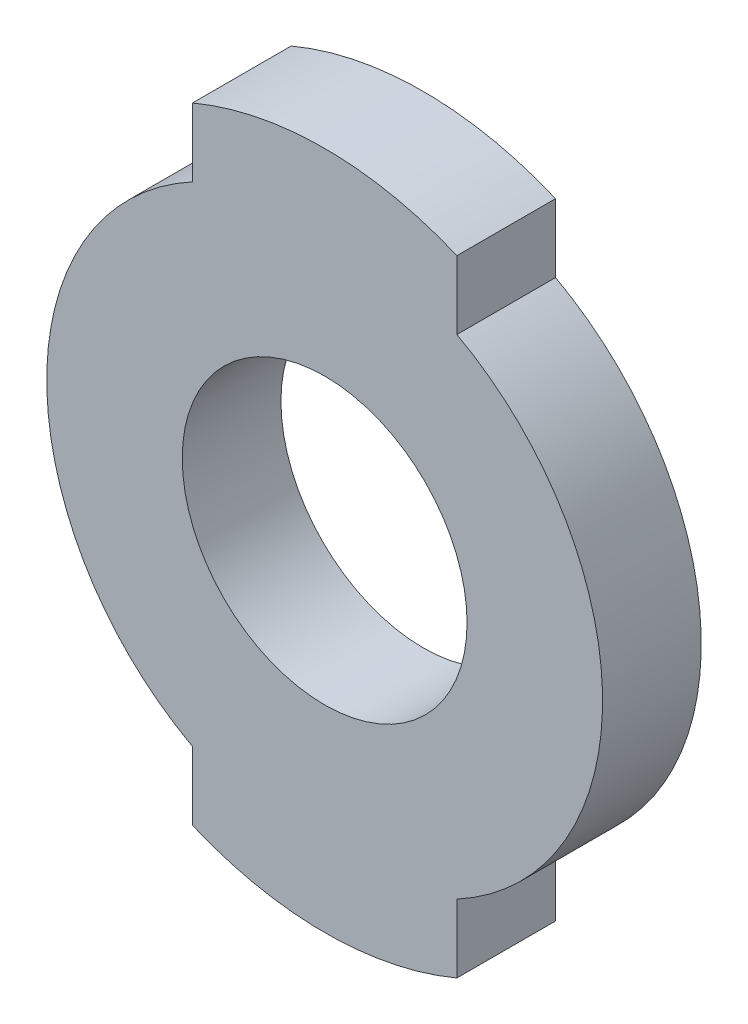
ISO-10303-21;
HEADER;
FILE_DESCRIPTION(('STEP AP214'),'2;1');
FILE_NAME('part.step','',(''),(''),'','','');
FILE_SCHEMA(('AUTOMOTIVE_DESIGN { 1 0 10303 214 1 1 1 1 }'));
ENDSEC;
DATA;
#1=APPLICATION_CONTEXT('core data for automotive mechanical design processes');
#2=APPLICATION_PROTOCOL_DEFINITION('international standard','automotive_design',2000,#1);
#3=PRODUCT_CONTEXT('',#1,'mechanical');
#4=PRODUCT('Part','Part','',(#3));
#5=PRODUCT_RELATED_PRODUCT_CATEGORY('part','',(#4));
#6=PRODUCT_DEFINITION_FORMATION('','',#4);
#7=PRODUCT_DEFINITION_CONTEXT('part definition',#1,'design');
#8=PRODUCT_DEFINITION('design','',#6,#7);
#9=PRODUCT_DEFINITION_SHAPE('','',#8);
#10=(LENGTH_UNIT() NAMED_UNIT(*) SI_UNIT(.MILLI.,.METRE.));
#11=(NAMED_UNIT(*) PLANE_ANGLE_UNIT() SI_UNIT($,.RADIAN.));
#12=(NAMED_UNIT(*) SI_UNIT($,.STERADIAN.) SOLID_ANGLE_UNIT());
#13=UNCERTAINTY_MEASURE_WITH_UNIT(LENGTH_MEASURE(1.E-05),#10,'distance_accuracy_value','');
#14=(GEOMETRIC_REPRESENTATION_CONTEXT(3) GLOBAL_UNCERTAINTY_ASSIGNED_CONTEXT((#13)) GLOBAL_UNIT_ASSIGNED_CONTEXT((#10,
#11,#12)) REPRESENTATION_CONTEXT('',''));
#15=CARTESIAN_POINT('',(0.,0.,0.));
#16=DIRECTION('',(0.,0.,1.));
#17=DIRECTION('',(1.,0.,0.));
#18=AXIS2_PLACEMENT_3D('',#15,#16,#17);
#19=CARTESIAN_POINT('',(0.,0.,6.));
#20=DIRECTION('',(0.,0.,-1.));
#21=DIRECTION('',(-1.,0.,0.));
#22=AXIS2_PLACEMENT_3D('',#19,#20,#21);
#23=CYLINDRICAL_SURFACE('',#22,20.65);
#24=CARTESIAN_POINT('',(0.,0.,6.));
#25=DIRECTION('',(0.,0.,1.));
#26=DIRECTION('',(1.,0.,0.));
#27=AXIS2_PLACEMENT_3D('',#24,#25,#26);
#28=CIRCLE('',#27,20.65);
#29=CARTESIAN_POINT('',(8.04,19.0205388987799,6.));
#30=VERTEX_POINT('',#29);
#31=CARTESIAN_POINT('',(-8.04,19.0205388987799,6.));
#32=VERTEX_POINT('',#31);
#33=EDGE_CURVE('E43',#30,#32,#28,.T.);
#34=ORIENTED_EDGE('',*,*,#33,.F.);
#35=DIRECTION('',(0.,0.,1.));
#36=VECTOR('',#35,1.);
#37=CARTESIAN_POINT('',(8.04,19.0205388987799,0.));
#38=LINE('',#37,#36);
#39=CARTESIAN_POINT('',(8.04,19.0205388987799,0.));
#40=VERTEX_POINT('',#39);
#41=EDGE_CURVE('E136',#40,#30,#38,.T.);
#42=ORIENTED_EDGE('',*,*,#41,.F.);
#43=CARTESIAN_POINT('',(0.,0.,0.));
#44=DIRECTION('',(0.,0.,1.));
#45=DIRECTION('',(1.,0.,0.));
#46=AXIS2_PLACEMENT_3D('',#43,#44,#45);
#47=CIRCLE('',#46,20.65);
#48=CARTESIAN_POINT('',(-8.04,19.0205388987799,0.));
#49=VERTEX_POINT('',#48);
#50=EDGE_CURVE('E58',#40,#49,#47,.T.);
#51=ORIENTED_EDGE('',*,*,#50,.T.);
#52=DIRECTION('',(0.,0.,1.));
#53=VECTOR('',#52,1.);
#54=CARTESIAN_POINT('',(-8.04,19.0205388987799,0.));
#55=LINE('',#54,#53);
#56=EDGE_CURVE('E161',#49,#32,#55,.T.);
#57=ORIENTED_EDGE('',*,*,#56,.T.);
#58=EDGE_LOOP('',(#34,#42,#51,#57));
#59=FACE_BOUND('',#58,.T.);
#60=ADVANCED_FACE('F34',(#59),#23,.T.);
#61=CARTESIAN_POINT('',(-8.03999999999999,-19.0205388987799,0.));
#62=VERTEX_POINT('',#61);
#63=CARTESIAN_POINT('',(8.03999999999999,-19.0205388987799,0.));
#64=VERTEX_POINT('',#63);
#65=EDGE_CURVE('E38',#62,#64,#47,.T.);
#66=ORIENTED_EDGE('',*,*,#65,.T.);
#67=DIRECTION('',(0.,0.,1.));
#68=VECTOR('',#67,1.);
#69=CARTESIAN_POINT('',(8.03999999999998,-19.0205388987799,0.));
#70=LINE('',#69,#68);
#71=CARTESIAN_POINT('',(8.03999999999998,-19.0205388987799,6.));
#72=VERTEX_POINT('',#71);
#73=EDGE_CURVE('E50',#64,#72,#70,.T.);
#74=ORIENTED_EDGE('',*,*,#73,.T.);
#75=CARTESIAN_POINT('',(-8.03999999999999,-19.0205388987799,6.));
#76=VERTEX_POINT('',#75);
#77=EDGE_CURVE('E11',#76,#72,#28,.T.);
#78=ORIENTED_EDGE('',*,*,#77,.F.);
#79=DIRECTION('',(0.,0.,1.));
#80=VECTOR('',#79,1.);
#81=CARTESIAN_POINT('',(-8.03999999999999,-19.0205388987799,0.));
#82=LINE('',#81,#80);
#83=EDGE_CURVE('E159',#62,#76,#82,.T.);
#84=ORIENTED_EDGE('',*,*,#83,.F.);
#85=EDGE_LOOP('',(#66,#74,#78,#84));
#86=FACE_BOUND('',#85,.T.);
#87=ADVANCED_FACE('F36',(#86),#23,.T.);
#88=CARTESIAN_POINT('',(0.,0.,6.));
#89=DIRECTION('',(0.,0.,1.));
#90=DIRECTION('',(1.,0.,0.));
#91=AXIS2_PLACEMENT_3D('',#88,#89,#90);
#92=PLANE('',#91);
#93=CARTESIAN_POINT('',(0.,0.,6.));
#94=DIRECTION('',(0.,0.,1.));
#95=DIRECTION('',(1.,0.,0.));
#96=AXIS2_PLACEMENT_3D('',#93,#94,#95);
#97=CIRCLE('',#96,8.66);
#98=CARTESIAN_POINT('',(8.66,0.,6.));
#99=VERTEX_POINT('',#98);
#100=EDGE_CURVE('E126',#99,#99,#97,.T.);
#101=ORIENTED_EDGE('',*,*,#100,.F.);
#102=EDGE_LOOP('',(#101));
#103=FACE_BOUND('',#102,.T.);
#104=DIRECTION('',(0.,-1.,0.));
#105=VECTOR('',#104,1.);
#106=CARTESIAN_POINT('',(8.04,14.865005886309,6.));
#107=LINE('',#106,#105);
#108=CARTESIAN_POINT('',(8.04,14.865005886309,6.));
#109=VERTEX_POINT('',#108);
#110=EDGE_CURVE('E120',#30,#109,#107,.T.);
#111=ORIENTED_EDGE('',*,*,#110,.F.);
#112=ORIENTED_EDGE('',*,*,#33,.T.);
#113=DIRECTION('',(0.,1.,0.));
#114=VECTOR('',#113,1.);
#115=CARTESIAN_POINT('',(-8.04,14.865005886309,6.));
#116=LINE('',#115,#114);
#117=CARTESIAN_POINT('',(-8.04,14.865005886309,6.));
#118=VERTEX_POINT('',#117);
#119=EDGE_CURVE('E152',#118,#32,#116,.T.);
#120=ORIENTED_EDGE('',*,*,#119,.F.);
#121=CARTESIAN_POINT('',(0.,0.,6.));
#122=DIRECTION('',(0.,0.,-1.));
#123=DIRECTION('',(1.,0.,0.));
#124=AXIS2_PLACEMENT_3D('',#121,#122,#123);
#125=CIRCLE('',#124,16.9);
#126=CARTESIAN_POINT('',(-8.04,-14.865005886309,6.));
#127=VERTEX_POINT('',#126);
#128=EDGE_CURVE('E135',#127,#118,#125,.T.);
#129=ORIENTED_EDGE('',*,*,#128,.F.);
#130=DIRECTION('',(0.,1.,0.));
#131=VECTOR('',#130,1.);
#132=CARTESIAN_POINT('',(-8.04,-14.865005886309,6.));
#133=LINE('',#132,#131);
#134=EDGE_CURVE('E143',#76,#127,#133,.T.);
#135=ORIENTED_EDGE('',*,*,#134,.F.);
#136=ORIENTED_EDGE('',*,*,#77,.T.);
#137=DIRECTION('',(0.,-1.,0.));
#138=VECTOR('',#137,1.);
#139=CARTESIAN_POINT('',(8.04,-14.865005886309,6.));
#140=LINE('',#139,#138);
#141=CARTESIAN_POINT('',(8.04,-14.865005886309,6.));
#142=VERTEX_POINT('',#141);
#143=EDGE_CURVE('E123',#142,#72,#140,.T.);
#144=ORIENTED_EDGE('',*,*,#143,.F.);
#145=CARTESIAN_POINT('',(0.,0.,6.));
#146=DIRECTION('',(0.,0.,-1.));
#147=DIRECTION('',(1.,0.,0.));
#148=AXIS2_PLACEMENT_3D('',#145,#146,#147);
#149=CIRCLE('',#148,16.9);
#150=EDGE_CURVE('E109',#109,#142,#149,.T.);
#151=ORIENTED_EDGE('',*,*,#150,.F.);
#152=EDGE_LOOP('',(#111,#112,#120,#129,#135,#136,#144,#151));
#153=FACE_BOUND('',#152,.T.);
#154=ADVANCED_FACE('F174',(#103,#153),#92,.T.);
#155=CARTESIAN_POINT('',(0.,0.,0.));
#156=DIRECTION('',(0.,0.,1.));
#157=DIRECTION('',(1.,0.,0.));
#158=AXIS2_PLACEMENT_3D('',#155,#156,#157);
#159=PLANE('',#158);
#160=CARTESIAN_POINT('',(0.,0.,0.));
#161=DIRECTION('',(0.,0.,1.));
#162=DIRECTION('',(1.,0.,0.));
#163=AXIS2_PLACEMENT_3D('',#160,#161,#162);
#164=CIRCLE('',#163,8.66);
#165=CARTESIAN_POINT('',(8.66,0.,0.));
#166=VERTEX_POINT('',#165);
#167=EDGE_CURVE('E131',#166,#166,#164,.T.);
#168=ORIENTED_EDGE('',*,*,#167,.T.);
#169=EDGE_LOOP('',(#168));
#170=FACE_BOUND('',#169,.T.);
#171=ORIENTED_EDGE('',*,*,#50,.F.);
#172=DIRECTION('',(0.,-1.,0.));
#173=VECTOR('',#172,1.);
#174=CARTESIAN_POINT('',(8.04,14.865005886309,0.));
#175=LINE('',#174,#173);
#176=CARTESIAN_POINT('',(8.04,14.865005886309,0.));
#177=VERTEX_POINT('',#176);
#178=EDGE_CURVE('E111',#40,#177,#175,.T.);
#179=ORIENTED_EDGE('',*,*,#178,.T.);
#180=CARTESIAN_POINT('',(0.,0.,0.));
#181=DIRECTION('',(0.,0.,-1.));
#182=DIRECTION('',(1.,0.,0.));
#183=AXIS2_PLACEMENT_3D('',#180,#181,#182);
#184=CIRCLE('',#183,16.9);
#185=CARTESIAN_POINT('',(8.04,-14.865005886309,0.));
#186=VERTEX_POINT('',#185);
#187=EDGE_CURVE('E106',#177,#186,#184,.T.);
#188=ORIENTED_EDGE('',*,*,#187,.T.);
#189=DIRECTION('',(0.,-1.,0.));
#190=VECTOR('',#189,1.);
#191=CARTESIAN_POINT('',(8.04,-14.865005886309,0.));
#192=LINE('',#191,#190);
#193=EDGE_CURVE('E113',#186,#64,#192,.T.);
#194=ORIENTED_EDGE('',*,*,#193,.T.);
#195=ORIENTED_EDGE('',*,*,#65,.F.);
#196=DIRECTION('',(0.,1.,0.));
#197=VECTOR('',#196,1.);
#198=CARTESIAN_POINT('',(-8.04,-14.865005886309,0.));
#199=LINE('',#198,#197);
#200=CARTESIAN_POINT('',(-8.04,-14.865005886309,0.));
#201=VERTEX_POINT('',#200);
#202=EDGE_CURVE('E146',#62,#201,#199,.T.);
#203=ORIENTED_EDGE('',*,*,#202,.T.);
#204=CARTESIAN_POINT('',(0.,0.,0.));
#205=DIRECTION('',(0.,0.,-1.));
#206=DIRECTION('',(1.,0.,0.));
#207=AXIS2_PLACEMENT_3D('',#204,#205,#206);
#208=CIRCLE('',#207,16.9);
#209=CARTESIAN_POINT('',(-8.04,14.865005886309,0.));
#210=VERTEX_POINT('',#209);
#211=EDGE_CURVE('E139',#201,#210,#208,.T.);
#212=ORIENTED_EDGE('',*,*,#211,.T.);
#213=DIRECTION('',(0.,1.,0.));
#214=VECTOR('',#213,1.);
#215=CARTESIAN_POINT('',(-8.04,14.865005886309,0.));
#216=LINE('',#215,#214);
#217=EDGE_CURVE('E142',#210,#49,#216,.T.);
#218=ORIENTED_EDGE('',*,*,#217,.T.);
#219=EDGE_LOOP('',(#171,#179,#188,#194,#195,#203,#212,#218));
#220=FACE_BOUND('',#219,.T.);
#221=ADVANCED_FACE('F119',(#170,#220),#159,.F.);
#222=CARTESIAN_POINT('',(0.,0.,0.));
#223=DIRECTION('',(0.,0.,1.));
#224=DIRECTION('',(1.,0.,0.));
#225=AXIS2_PLACEMENT_3D('',#222,#223,#224);
#226=CYLINDRICAL_SURFACE('',#225,16.9);
#227=ORIENTED_EDGE('',*,*,#128,.T.);
#228=DIRECTION('',(0.,0.,1.));
#229=VECTOR('',#228,1.);
#230=CARTESIAN_POINT('',(-8.04,14.865005886309,0.));
#231=LINE('',#230,#229);
#232=EDGE_CURVE('E149',#210,#118,#231,.T.);
#233=ORIENTED_EDGE('',*,*,#232,.F.);
#234=ORIENTED_EDGE('',*,*,#211,.F.);
#235=DIRECTION('',(0.,0.,1.));
#236=VECTOR('',#235,1.);
#237=CARTESIAN_POINT('',(-8.04,-14.865005886309,0.));
#238=LINE('',#237,#236);
#239=EDGE_CURVE('E157',#201,#127,#238,.T.);
#240=ORIENTED_EDGE('',*,*,#239,.T.);
#241=EDGE_LOOP('',(#227,#233,#234,#240));
#242=FACE_BOUND('',#241,.T.);
#243=ADVANCED_FACE('F170',(#242),#226,.T.);
#244=CARTESIAN_POINT('',(-8.04,-14.865005886309,0.));
#245=DIRECTION('',(1.,0.,0.));
#246=DIRECTION('',(0.,1.,0.));
#247=AXIS2_PLACEMENT_3D('',#244,#245,#246);
#248=PLANE('',#247);
#249=ORIENTED_EDGE('',*,*,#134,.T.);
#250=ORIENTED_EDGE('',*,*,#239,.F.);
#251=ORIENTED_EDGE('',*,*,#202,.F.);
#252=ORIENTED_EDGE('',*,*,#83,.T.);
#253=EDGE_LOOP('',(#249,#250,#251,#252));
#254=FACE_BOUND('',#253,.T.);
#255=ADVANCED_FACE('F180',(#254),#248,.F.);
#256=CARTESIAN_POINT('',(-8.04,14.865005886309,0.));
#257=DIRECTION('',(1.,0.,0.));
#258=DIRECTION('',(0.,0.,-1.));
#259=AXIS2_PLACEMENT_3D('',#256,#257,#258);
#260=PLANE('',#259);
#261=ORIENTED_EDGE('',*,*,#119,.T.);
#262=ORIENTED_EDGE('',*,*,#56,.F.);
#263=ORIENTED_EDGE('',*,*,#217,.F.);
#264=ORIENTED_EDGE('',*,*,#232,.T.);
#265=EDGE_LOOP('',(#261,#262,#263,#264));
#266=FACE_BOUND('',#265,.T.);
#267=ADVANCED_FACE('F165',(#266),#260,.F.);
#268=CARTESIAN_POINT('',(0.,0.,0.));
#269=DIRECTION('',(0.,0.,1.));
#270=DIRECTION('',(1.,0.,0.));
#271=AXIS2_PLACEMENT_3D('',#268,#269,#270);
#272=CYLINDRICAL_SURFACE('',#271,16.9);
#273=ORIENTED_EDGE('',*,*,#150,.T.);
#274=DIRECTION('',(0.,0.,1.));
#275=VECTOR('',#274,1.);
#276=CARTESIAN_POINT('',(8.04,-14.865005886309,0.));
#277=LINE('',#276,#275);
#278=EDGE_CURVE('E103',#186,#142,#277,.T.);
#279=ORIENTED_EDGE('',*,*,#278,.F.);
#280=ORIENTED_EDGE('',*,*,#187,.F.);
#281=DIRECTION('',(0.,0.,1.));
#282=VECTOR('',#281,1.);
#283=CARTESIAN_POINT('',(8.04,14.865005886309,0.));
#284=LINE('',#283,#282);
#285=EDGE_CURVE('E133',#177,#109,#284,.T.);
#286=ORIENTED_EDGE('',*,*,#285,.T.);
#287=EDGE_LOOP('',(#273,#279,#280,#286));
#288=FACE_BOUND('',#287,.T.);
#289=ADVANCED_FACE('F104',(#288),#272,.T.);
#290=CARTESIAN_POINT('',(8.04,14.865005886309,0.));
#291=DIRECTION('',(-1.,0.,0.));
#292=DIRECTION('',(0.,0.,1.));
#293=AXIS2_PLACEMENT_3D('',#290,#291,#292);
#294=PLANE('',#293);
#295=ORIENTED_EDGE('',*,*,#110,.T.);
#296=ORIENTED_EDGE('',*,*,#285,.F.);
#297=ORIENTED_EDGE('',*,*,#178,.F.);
#298=ORIENTED_EDGE('',*,*,#41,.T.);
#299=EDGE_LOOP('',(#295,#296,#297,#298));
#300=FACE_BOUND('',#299,.T.);
#301=ADVANCED_FACE('F215',(#300),#294,.F.);
#302=CARTESIAN_POINT('',(8.04,-14.865005886309,0.));
#303=DIRECTION('',(-1.,0.,0.));
#304=DIRECTION('',(0.,-1.,0.));
#305=AXIS2_PLACEMENT_3D('',#302,#303,#304);
#306=PLANE('',#305);
#307=ORIENTED_EDGE('',*,*,#143,.T.);
#308=ORIENTED_EDGE('',*,*,#73,.F.);
#309=ORIENTED_EDGE('',*,*,#193,.F.);
#310=ORIENTED_EDGE('',*,*,#278,.T.);
#311=EDGE_LOOP('',(#307,#308,#309,#310));
#312=FACE_BOUND('',#311,.T.);
#313=ADVANCED_FACE('F114',(#312),#306,.F.);
#314=CARTESIAN_POINT('',(0.,0.,0.));
#315=DIRECTION('',(0.,0.,1.));
#316=DIRECTION('',(1.,0.,0.));
#317=AXIS2_PLACEMENT_3D('',#314,#315,#316);
#318=CYLINDRICAL_SURFACE('',#317,8.66);
#319=ORIENTED_EDGE('',*,*,#167,.F.);
#320=EDGE_LOOP('',(#319));
#321=FACE_BOUND('',#320,.T.);
#322=ORIENTED_EDGE('',*,*,#100,.T.);
#323=EDGE_LOOP('',(#322));
#324=FACE_BOUND('',#323,.T.);
#325=ADVANCED_FACE('F209',(#321,#324),#318,.F.);
#326=CLOSED_SHELL('',(#60,#87,#154,#221,#243,#255,#267,#289,#301,#313,#325));
#327=MANIFOLD_SOLID_BREP('B2',#326);
#328=ADVANCED_BREP_SHAPE_REPRESENTATION('',(#18,#327),#14);
#329=SHAPE_DEFINITION_REPRESENTATION(#9,#328);
ENDSEC;
END-ISO-10303-21;
